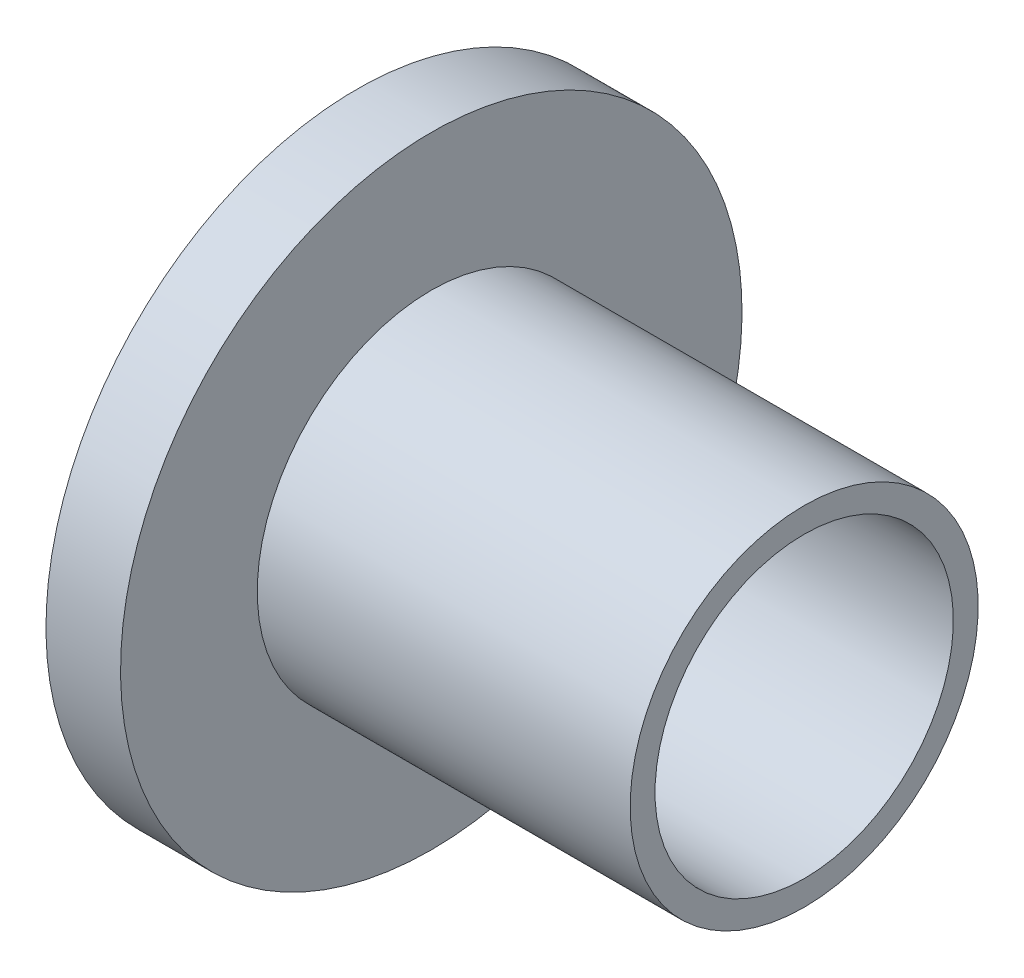
ISO-10303-21;
HEADER;
FILE_DESCRIPTION(('STEP AP214'),'2;1');
FILE_NAME('part.step','',(''),(''),'','','');
FILE_SCHEMA(('AUTOMOTIVE_DESIGN { 1 0 10303 214 1 1 1 1 }'));
ENDSEC;
DATA;
#1=APPLICATION_CONTEXT('core data for automotive mechanical design processes');
#2=APPLICATION_PROTOCOL_DEFINITION('international standard','automotive_design',2000,#1);
#3=PRODUCT_CONTEXT('',#1,'mechanical');
#4=PRODUCT('Part','Part','',(#3));
#5=PRODUCT_RELATED_PRODUCT_CATEGORY('part','',(#4));
#6=PRODUCT_DEFINITION_FORMATION('','',#4);
#7=PRODUCT_DEFINITION_CONTEXT('part definition',#1,'design');
#8=PRODUCT_DEFINITION('design','',#6,#7);
#9=PRODUCT_DEFINITION_SHAPE('','',#8);
#10=(LENGTH_UNIT() NAMED_UNIT(*) SI_UNIT(.MILLI.,.METRE.));
#11=(NAMED_UNIT(*) PLANE_ANGLE_UNIT() SI_UNIT($,.RADIAN.));
#12=(NAMED_UNIT(*) SI_UNIT($,.STERADIAN.) SOLID_ANGLE_UNIT());
#13=UNCERTAINTY_MEASURE_WITH_UNIT(LENGTH_MEASURE(1.E-05),#10,'distance_accuracy_value','');
#14=(GEOMETRIC_REPRESENTATION_CONTEXT(3) GLOBAL_UNCERTAINTY_ASSIGNED_CONTEXT((#13)) GLOBAL_UNIT_ASSIGNED_CONTEXT((#10,
#11,#12)) REPRESENTATION_CONTEXT('',''));
#15=CARTESIAN_POINT('',(0.,0.,0.));
#16=DIRECTION('',(0.,0.,1.));
#17=DIRECTION('',(1.,0.,0.));
#18=AXIS2_PLACEMENT_3D('',#15,#16,#17);
#19=CARTESIAN_POINT('',(-64.9001174574378,0.,0.));
#20=DIRECTION('',(-1.,0.,0.));
#21=DIRECTION('',(0.,-1.,0.));
#22=AXIS2_PLACEMENT_3D('',#19,#20,#21);
#23=CYLINDRICAL_SURFACE('',#22,25.);
#24=CARTESIAN_POINT('',(-5.99999999999999,0.,0.));
#25=DIRECTION('',(-1.,0.,0.));
#26=DIRECTION('',(0.,-1.,0.));
#27=AXIS2_PLACEMENT_3D('',#24,#25,#26);
#28=CIRCLE('',#27,25.);
#29=CARTESIAN_POINT('',(-5.99999999999999,-25.,0.));
#30=VERTEX_POINT('',#29);
#31=EDGE_CURVE('E10',#30,#30,#28,.T.);
#32=ORIENTED_EDGE('',*,*,#31,.F.);
#33=EDGE_LOOP('',(#32));
#34=FACE_BOUND('',#33,.T.);
#35=CARTESIAN_POINT('',(0.,0.,0.));
#36=DIRECTION('',(-1.,0.,0.));
#37=DIRECTION('',(0.,-1.,0.));
#38=AXIS2_PLACEMENT_3D('',#35,#36,#37);
#39=CIRCLE('',#38,25.);
#40=CARTESIAN_POINT('',(0.,-25.,0.));
#41=VERTEX_POINT('',#40);
#42=EDGE_CURVE('E58',#41,#41,#39,.T.);
#43=ORIENTED_EDGE('',*,*,#42,.T.);
#44=EDGE_LOOP('',(#43));
#45=FACE_BOUND('',#44,.T.);
#46=ADVANCED_FACE('F30',(#34,#45),#23,.T.);
#47=CARTESIAN_POINT('',(-6.,25.,0.));
#48=DIRECTION('',(1.,0.,0.));
#49=DIRECTION('',(0.,1.,0.));
#50=AXIS2_PLACEMENT_3D('',#47,#48,#49);
#51=PLANE('',#50);
#52=CARTESIAN_POINT('',(-5.99999999999999,0.,0.));
#53=DIRECTION('',(-1.,0.,0.));
#54=DIRECTION('',(0.,-1.,0.));
#55=AXIS2_PLACEMENT_3D('',#52,#53,#54);
#56=CIRCLE('',#55,10.);
#57=CARTESIAN_POINT('',(-5.99999999999999,-10.,0.));
#58=VERTEX_POINT('',#57);
#59=EDGE_CURVE('E36',#58,#58,#56,.T.);
#60=ORIENTED_EDGE('',*,*,#59,.F.);
#61=EDGE_LOOP('',(#60));
#62=FACE_BOUND('',#61,.T.);
#63=ORIENTED_EDGE('',*,*,#31,.T.);
#64=EDGE_LOOP('',(#63));
#65=FACE_BOUND('',#64,.T.);
#66=ADVANCED_FACE('F95',(#62,#65),#51,.F.);
#67=CARTESIAN_POINT('',(-64.9001174574378,0.,0.));
#68=DIRECTION('',(-1.,0.,0.));
#69=DIRECTION('',(0.,-1.,0.));
#70=AXIS2_PLACEMENT_3D('',#67,#68,#69);
#71=CYLINDRICAL_SURFACE('',#70,10.);
#72=CARTESIAN_POINT('',(0.,0.,0.));
#73=DIRECTION('',(-1.,0.,0.));
#74=DIRECTION('',(0.,-1.,0.));
#75=AXIS2_PLACEMENT_3D('',#72,#73,#74);
#76=CIRCLE('',#75,10.);
#77=CARTESIAN_POINT('',(0.,-10.,0.));
#78=VERTEX_POINT('',#77);
#79=EDGE_CURVE('E40',#78,#78,#76,.T.);
#80=ORIENTED_EDGE('',*,*,#79,.F.);
#81=EDGE_LOOP('',(#80));
#82=FACE_BOUND('',#81,.T.);
#83=ORIENTED_EDGE('',*,*,#59,.T.);
#84=EDGE_LOOP('',(#83));
#85=FACE_BOUND('',#84,.T.);
#86=ADVANCED_FACE('F90',(#82,#85),#71,.F.);
#87=CARTESIAN_POINT('',(0.,10.,0.));
#88=DIRECTION('',(-1.,0.,0.));
#89=DIRECTION('',(0.,-1.,0.));
#90=AXIS2_PLACEMENT_3D('',#87,#88,#89);
#91=PLANE('',#90);
#92=CARTESIAN_POINT('',(0.,0.,0.));
#93=DIRECTION('',(-1.,0.,0.));
#94=DIRECTION('',(0.,-1.,0.));
#95=AXIS2_PLACEMENT_3D('',#92,#93,#94);
#96=CIRCLE('',#95,12.);
#97=CARTESIAN_POINT('',(0.,-12.,0.));
#98=VERTEX_POINT('',#97);
#99=EDGE_CURVE('E44',#98,#98,#96,.T.);
#100=ORIENTED_EDGE('',*,*,#99,.F.);
#101=EDGE_LOOP('',(#100));
#102=FACE_BOUND('',#101,.T.);
#103=ORIENTED_EDGE('',*,*,#79,.T.);
#104=EDGE_LOOP('',(#103));
#105=FACE_BOUND('',#104,.T.);
#106=ADVANCED_FACE('F84',(#102,#105),#91,.F.);
#107=CARTESIAN_POINT('',(-64.9001174574378,0.,0.));
#108=DIRECTION('',(-1.,0.,0.));
#109=DIRECTION('',(0.,-1.,0.));
#110=AXIS2_PLACEMENT_3D('',#107,#108,#109);
#111=CYLINDRICAL_SURFACE('',#110,12.);
#112=CARTESIAN_POINT('',(30.,0.,0.));
#113=DIRECTION('',(-1.,0.,0.));
#114=DIRECTION('',(0.,-1.,0.));
#115=AXIS2_PLACEMENT_3D('',#112,#113,#114);
#116=CIRCLE('',#115,12.);
#117=CARTESIAN_POINT('',(30.,-12.,0.));
#118=VERTEX_POINT('',#117);
#119=EDGE_CURVE('E49',#118,#118,#116,.T.);
#120=ORIENTED_EDGE('',*,*,#119,.F.);
#121=EDGE_LOOP('',(#120));
#122=FACE_BOUND('',#121,.T.);
#123=ORIENTED_EDGE('',*,*,#99,.T.);
#124=EDGE_LOOP('',(#123));
#125=FACE_BOUND('',#124,.T.);
#126=ADVANCED_FACE('F78',(#122,#125),#111,.F.);
#127=CARTESIAN_POINT('',(30.,12.,0.));
#128=DIRECTION('',(-1.,0.,0.));
#129=DIRECTION('',(0.,-1.,0.));
#130=AXIS2_PLACEMENT_3D('',#127,#128,#129);
#131=PLANE('',#130);
#132=CARTESIAN_POINT('',(30.,0.,0.));
#133=DIRECTION('',(-1.,0.,0.));
#134=DIRECTION('',(0.,-1.,0.));
#135=AXIS2_PLACEMENT_3D('',#132,#133,#134);
#136=CIRCLE('',#135,14.);
#137=CARTESIAN_POINT('',(30.,-14.,0.));
#138=VERTEX_POINT('',#137);
#139=EDGE_CURVE('E52',#138,#138,#136,.T.);
#140=ORIENTED_EDGE('',*,*,#139,.F.);
#141=EDGE_LOOP('',(#140));
#142=FACE_BOUND('',#141,.T.);
#143=ORIENTED_EDGE('',*,*,#119,.T.);
#144=EDGE_LOOP('',(#143));
#145=FACE_BOUND('',#144,.T.);
#146=ADVANCED_FACE('F72',(#142,#145),#131,.F.);
#147=CARTESIAN_POINT('',(-64.9001174574378,0.,0.));
#148=DIRECTION('',(-1.,0.,0.));
#149=DIRECTION('',(0.,-1.,0.));
#150=AXIS2_PLACEMENT_3D('',#147,#148,#149);
#151=CYLINDRICAL_SURFACE('',#150,14.);
#152=CARTESIAN_POINT('',(0.,0.,0.));
#153=DIRECTION('',(-1.,0.,0.));
#154=DIRECTION('',(0.,-1.,0.));
#155=AXIS2_PLACEMENT_3D('',#152,#153,#154);
#156=CIRCLE('',#155,14.);
#157=CARTESIAN_POINT('',(0.,-14.,0.));
#158=VERTEX_POINT('',#157);
#159=EDGE_CURVE('E55',#158,#158,#156,.T.);
#160=ORIENTED_EDGE('',*,*,#159,.F.);
#161=EDGE_LOOP('',(#160));
#162=FACE_BOUND('',#161,.T.);
#163=ORIENTED_EDGE('',*,*,#139,.T.);
#164=EDGE_LOOP('',(#163));
#165=FACE_BOUND('',#164,.T.);
#166=ADVANCED_FACE('F66',(#162,#165),#151,.T.);
#167=CARTESIAN_POINT('',(0.,14.,0.));
#168=DIRECTION('',(-1.,0.,0.));
#169=DIRECTION('',(0.,-1.,0.));
#170=AXIS2_PLACEMENT_3D('',#167,#168,#169);
#171=PLANE('',#170);
#172=ORIENTED_EDGE('',*,*,#42,.F.);
#173=EDGE_LOOP('',(#172));
#174=FACE_BOUND('',#173,.T.);
#175=ORIENTED_EDGE('',*,*,#159,.T.);
#176=EDGE_LOOP('',(#175));
#177=FACE_BOUND('',#176,.T.);
#178=ADVANCED_FACE('F63',(#174,#177),#171,.F.);
#179=CLOSED_SHELL('',(#46,#66,#86,#106,#126,#146,#166,#178));
#180=MANIFOLD_SOLID_BREP('B2',#179);
#181=ADVANCED_BREP_SHAPE_REPRESENTATION('',(#18,#180),#14);
#182=SHAPE_DEFINITION_REPRESENTATION(#9,#181);
ENDSEC;
END-ISO-10303-21;
